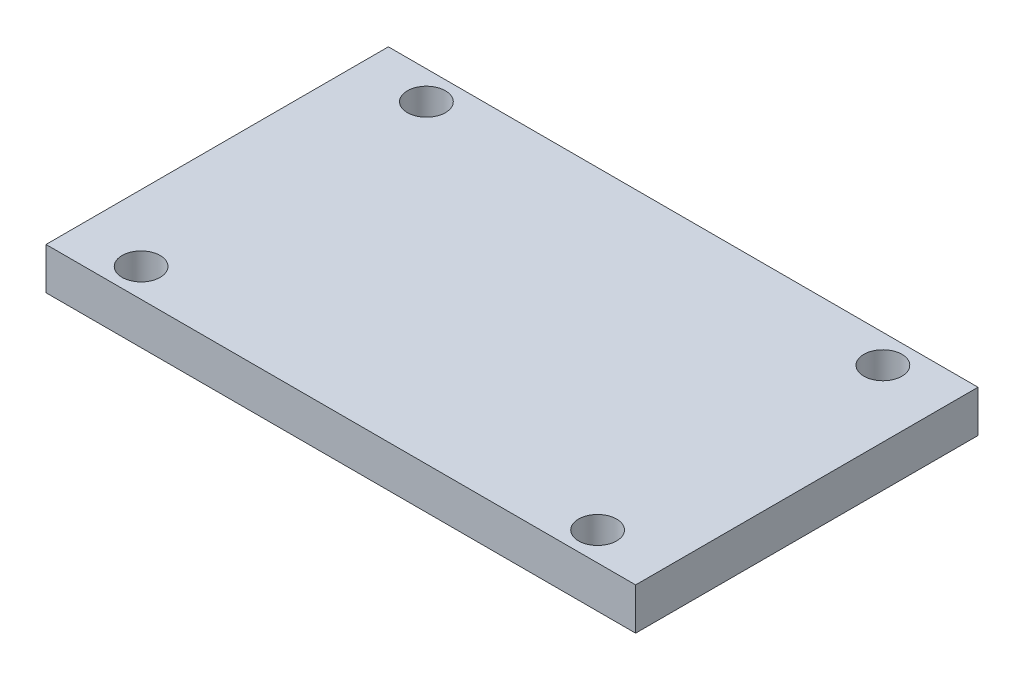
ISO-10303-21;
HEADER;
FILE_DESCRIPTION(('STEP AP214'),'2;1');
FILE_NAME('part.step','',(''),(''),'','','');
FILE_SCHEMA(('AUTOMOTIVE_DESIGN { 1 0 10303 214 1 1 1 1 }'));
ENDSEC;
DATA;
#1=APPLICATION_CONTEXT('core data for automotive mechanical design processes');
#2=APPLICATION_PROTOCOL_DEFINITION('international standard','automotive_design',2000,#1);
#3=PRODUCT_CONTEXT('',#1,'mechanical');
#4=PRODUCT('Part','Part','',(#3));
#5=PRODUCT_RELATED_PRODUCT_CATEGORY('part','',(#4));
#6=PRODUCT_DEFINITION_FORMATION('','',#4);
#7=PRODUCT_DEFINITION_CONTEXT('part definition',#1,'design');
#8=PRODUCT_DEFINITION('design','',#6,#7);
#9=PRODUCT_DEFINITION_SHAPE('','',#8);
#10=(LENGTH_UNIT() NAMED_UNIT(*) SI_UNIT(.MILLI.,.METRE.));
#11=(NAMED_UNIT(*) PLANE_ANGLE_UNIT() SI_UNIT($,.RADIAN.));
#12=(NAMED_UNIT(*) SI_UNIT($,.STERADIAN.) SOLID_ANGLE_UNIT());
#13=UNCERTAINTY_MEASURE_WITH_UNIT(LENGTH_MEASURE(1.E-05),#10,'distance_accuracy_value','');
#14=(GEOMETRIC_REPRESENTATION_CONTEXT(3) GLOBAL_UNCERTAINTY_ASSIGNED_CONTEXT((#13)) GLOBAL_UNIT_ASSIGNED_CONTEXT((#10,
#11,#12)) REPRESENTATION_CONTEXT('',''));
#15=CARTESIAN_POINT('',(0.,0.,0.));
#16=DIRECTION('',(0.,0.,1.));
#17=DIRECTION('',(1.,0.,0.));
#18=AXIS2_PLACEMENT_3D('',#15,#16,#17);
#19=CARTESIAN_POINT('',(77.5,11.,-45.));
#20=DIRECTION('',(-1.,0.,0.));
#21=DIRECTION('',(0.,0.,1.));
#22=AXIS2_PLACEMENT_3D('',#19,#20,#21);
#23=PLANE('',#22);
#24=DIRECTION('',(0.,0.,-1.));
#25=VECTOR('',#24,1.);
#26=CARTESIAN_POINT('',(77.5,0.,-45.));
#27=LINE('',#26,#25);
#28=CARTESIAN_POINT('',(77.5,0.,45.));
#29=VERTEX_POINT('',#28);
#30=CARTESIAN_POINT('',(77.5,0.,-45.));
#31=VERTEX_POINT('',#30);
#32=EDGE_CURVE('E104',#29,#31,#27,.T.);
#33=ORIENTED_EDGE('',*,*,#32,.T.);
#34=DIRECTION('',(0.,-1.,0.));
#35=VECTOR('',#34,1.);
#36=CARTESIAN_POINT('',(77.5,11.,-45.));
#37=LINE('',#36,#35);
#38=CARTESIAN_POINT('',(77.5,11.,-45.));
#39=VERTEX_POINT('',#38);
#40=EDGE_CURVE('E11',#39,#31,#37,.T.);
#41=ORIENTED_EDGE('',*,*,#40,.F.);
#42=DIRECTION('',(0.,0.,-1.));
#43=VECTOR('',#42,1.);
#44=CARTESIAN_POINT('',(77.5,11.,-45.));
#45=LINE('',#44,#43);
#46=CARTESIAN_POINT('',(77.5,11.,45.));
#47=VERTEX_POINT('',#46);
#48=EDGE_CURVE('E92',#47,#39,#45,.T.);
#49=ORIENTED_EDGE('',*,*,#48,.F.);
#50=DIRECTION('',(0.,-1.,0.));
#51=VECTOR('',#50,1.);
#52=CARTESIAN_POINT('',(77.5,11.,45.));
#53=LINE('',#52,#51);
#54=EDGE_CURVE('E100',#47,#29,#53,.T.);
#55=ORIENTED_EDGE('',*,*,#54,.T.);
#56=EDGE_LOOP('',(#33,#41,#49,#55));
#57=FACE_BOUND('',#56,.T.);
#58=ADVANCED_FACE('F41',(#57),#23,.F.);
#59=CARTESIAN_POINT('',(-77.5,11.,-45.));
#60=DIRECTION('',(0.,0.,1.));
#61=DIRECTION('',(1.,0.,0.));
#62=AXIS2_PLACEMENT_3D('',#59,#60,#61);
#63=PLANE('',#62);
#64=DIRECTION('',(-1.,0.,0.));
#65=VECTOR('',#64,1.);
#66=CARTESIAN_POINT('',(-77.5,0.,-45.));
#67=LINE('',#66,#65);
#68=CARTESIAN_POINT('',(-77.5,0.,-45.));
#69=VERTEX_POINT('',#68);
#70=EDGE_CURVE('E96',#31,#69,#67,.T.);
#71=ORIENTED_EDGE('',*,*,#70,.T.);
#72=DIRECTION('',(0.,-1.,0.));
#73=VECTOR('',#72,1.);
#74=CARTESIAN_POINT('',(-77.5,11.,-45.));
#75=LINE('',#74,#73);
#76=CARTESIAN_POINT('',(-77.5,11.,-45.));
#77=VERTEX_POINT('',#76);
#78=EDGE_CURVE('E49',#77,#69,#75,.T.);
#79=ORIENTED_EDGE('',*,*,#78,.F.);
#80=DIRECTION('',(-1.,0.,0.));
#81=VECTOR('',#80,1.);
#82=CARTESIAN_POINT('',(-77.5,11.,-45.));
#83=LINE('',#82,#81);
#84=EDGE_CURVE('E87',#39,#77,#83,.T.);
#85=ORIENTED_EDGE('',*,*,#84,.F.);
#86=ORIENTED_EDGE('',*,*,#40,.T.);
#87=EDGE_LOOP('',(#71,#79,#85,#86));
#88=FACE_BOUND('',#87,.T.);
#89=ADVANCED_FACE('F95',(#88),#63,.F.);
#90=CARTESIAN_POINT('',(-77.5,11.,-45.));
#91=DIRECTION('',(1.,0.,0.));
#92=DIRECTION('',(0.,0.,-1.));
#93=AXIS2_PLACEMENT_3D('',#90,#91,#92);
#94=PLANE('',#93);
#95=DIRECTION('',(0.,0.,1.));
#96=VECTOR('',#95,1.);
#97=CARTESIAN_POINT('',(-77.5,0.,-45.));
#98=LINE('',#97,#96);
#99=CARTESIAN_POINT('',(-77.5,0.,45.));
#100=VERTEX_POINT('',#99);
#101=EDGE_CURVE('E74',#69,#100,#98,.T.);
#102=ORIENTED_EDGE('',*,*,#101,.T.);
#103=DIRECTION('',(0.,-1.,0.));
#104=VECTOR('',#103,1.);
#105=CARTESIAN_POINT('',(-77.5,11.,45.));
#106=LINE('',#105,#104);
#107=CARTESIAN_POINT('',(-77.5,11.,45.));
#108=VERTEX_POINT('',#107);
#109=EDGE_CURVE('E97',#108,#100,#106,.T.);
#110=ORIENTED_EDGE('',*,*,#109,.F.);
#111=DIRECTION('',(0.,0.,1.));
#112=VECTOR('',#111,1.);
#113=CARTESIAN_POINT('',(-77.5,11.,-45.));
#114=LINE('',#113,#112);
#115=EDGE_CURVE('E90',#77,#108,#114,.T.);
#116=ORIENTED_EDGE('',*,*,#115,.F.);
#117=ORIENTED_EDGE('',*,*,#78,.T.);
#118=EDGE_LOOP('',(#102,#110,#116,#117));
#119=FACE_BOUND('',#118,.T.);
#120=ADVANCED_FACE('F98',(#119),#94,.F.);
#121=CARTESIAN_POINT('',(-77.5,11.,45.));
#122=DIRECTION('',(0.,0.,-1.));
#123=DIRECTION('',(-1.,0.,0.));
#124=AXIS2_PLACEMENT_3D('',#121,#122,#123);
#125=PLANE('',#124);
#126=DIRECTION('',(1.,0.,0.));
#127=VECTOR('',#126,1.);
#128=CARTESIAN_POINT('',(-77.5,0.,45.));
#129=LINE('',#128,#127);
#130=EDGE_CURVE('E80',#100,#29,#129,.T.);
#131=ORIENTED_EDGE('',*,*,#130,.T.);
#132=ORIENTED_EDGE('',*,*,#54,.F.);
#133=DIRECTION('',(1.,0.,0.));
#134=VECTOR('',#133,1.);
#135=CARTESIAN_POINT('',(-77.5,11.,45.));
#136=LINE('',#135,#134);
#137=EDGE_CURVE('E57',#108,#47,#136,.T.);
#138=ORIENTED_EDGE('',*,*,#137,.F.);
#139=ORIENTED_EDGE('',*,*,#109,.T.);
#140=EDGE_LOOP('',(#131,#132,#138,#139));
#141=FACE_BOUND('',#140,.T.);
#142=ADVANCED_FACE('F112',(#141),#125,.F.);
#143=CARTESIAN_POINT('',(0.,11.,0.));
#144=DIRECTION('',(0.,1.,0.));
#145=DIRECTION('',(0.,0.,1.));
#146=AXIS2_PLACEMENT_3D('',#143,#144,#145);
#147=PLANE('',#146);
#148=CARTESIAN_POINT('',(-60.,11.,-37.5));
#149=DIRECTION('',(0.,-1.,0.));
#150=DIRECTION('',(0.,0.,-1.));
#151=AXIS2_PLACEMENT_3D('',#148,#149,#150);
#152=CIRCLE('',#151,5.);
#153=CARTESIAN_POINT('',(-60.,11.,-42.5));
#154=VERTEX_POINT('',#153);
#155=EDGE_CURVE('E124',#154,#154,#152,.T.);
#156=ORIENTED_EDGE('',*,*,#155,.T.);
#157=EDGE_LOOP('',(#156));
#158=FACE_BOUND('',#157,.T.);
#159=CARTESIAN_POINT('',(-60.,11.,37.5));
#160=DIRECTION('',(0.,-1.,0.));
#161=DIRECTION('',(0.,0.,-1.));
#162=AXIS2_PLACEMENT_3D('',#159,#160,#161);
#163=CIRCLE('',#162,5.00000000000001);
#164=CARTESIAN_POINT('',(-60.,11.,32.5));
#165=VERTEX_POINT('',#164);
#166=EDGE_CURVE('E130',#165,#165,#163,.T.);
#167=ORIENTED_EDGE('',*,*,#166,.T.);
#168=EDGE_LOOP('',(#167));
#169=FACE_BOUND('',#168,.T.);
#170=CARTESIAN_POINT('',(60.,11.,37.5));
#171=DIRECTION('',(0.,-1.,0.));
#172=DIRECTION('',(0.,0.,-1.));
#173=AXIS2_PLACEMENT_3D('',#170,#171,#172);
#174=CIRCLE('',#173,5.00000000000001);
#175=CARTESIAN_POINT('',(60.,11.,32.5));
#176=VERTEX_POINT('',#175);
#177=EDGE_CURVE('E136',#176,#176,#174,.T.);
#178=ORIENTED_EDGE('',*,*,#177,.T.);
#179=EDGE_LOOP('',(#178));
#180=FACE_BOUND('',#179,.T.);
#181=CARTESIAN_POINT('',(60.,11.,-37.4999999999999));
#182=DIRECTION('',(0.,-1.,0.));
#183=DIRECTION('',(0.,0.,-1.));
#184=AXIS2_PLACEMENT_3D('',#181,#182,#183);
#185=CIRCLE('',#184,5.00000000000001);
#186=CARTESIAN_POINT('',(60.,11.,-42.4999999999999));
#187=VERTEX_POINT('',#186);
#188=EDGE_CURVE('E107',#187,#187,#185,.T.);
#189=ORIENTED_EDGE('',*,*,#188,.T.);
#190=EDGE_LOOP('',(#189));
#191=FACE_BOUND('',#190,.T.);
#192=ORIENTED_EDGE('',*,*,#48,.T.);
#193=ORIENTED_EDGE('',*,*,#84,.T.);
#194=ORIENTED_EDGE('',*,*,#115,.T.);
#195=ORIENTED_EDGE('',*,*,#137,.T.);
#196=EDGE_LOOP('',(#192,#193,#194,#195));
#197=FACE_BOUND('',#196,.T.);
#198=ADVANCED_FACE('F88',(#158,#169,#180,#191,#197),#147,.T.);
#199=CARTESIAN_POINT('',(0.,0.,0.));
#200=DIRECTION('',(0.,1.,0.));
#201=DIRECTION('',(0.,0.,1.));
#202=AXIS2_PLACEMENT_3D('',#199,#200,#201);
#203=PLANE('',#202);
#204=CARTESIAN_POINT('',(-60.,0.,-37.5));
#205=DIRECTION('',(0.,-1.,0.));
#206=DIRECTION('',(0.,0.,-1.));
#207=AXIS2_PLACEMENT_3D('',#204,#205,#206);
#208=CIRCLE('',#207,5.);
#209=CARTESIAN_POINT('',(-60.,0.,-42.5));
#210=VERTEX_POINT('',#209);
#211=EDGE_CURVE('E127',#210,#210,#208,.T.);
#212=ORIENTED_EDGE('',*,*,#211,.F.);
#213=EDGE_LOOP('',(#212));
#214=FACE_BOUND('',#213,.T.);
#215=CARTESIAN_POINT('',(-60.,0.,37.5));
#216=DIRECTION('',(0.,-1.,0.));
#217=DIRECTION('',(0.,0.,-1.));
#218=AXIS2_PLACEMENT_3D('',#215,#216,#217);
#219=CIRCLE('',#218,5.00000000000001);
#220=CARTESIAN_POINT('',(-60.,0.,32.5));
#221=VERTEX_POINT('',#220);
#222=EDGE_CURVE('E133',#221,#221,#219,.T.);
#223=ORIENTED_EDGE('',*,*,#222,.F.);
#224=EDGE_LOOP('',(#223));
#225=FACE_BOUND('',#224,.T.);
#226=CARTESIAN_POINT('',(60.,0.,37.5));
#227=DIRECTION('',(0.,-1.,0.));
#228=DIRECTION('',(0.,0.,-1.));
#229=AXIS2_PLACEMENT_3D('',#226,#227,#228);
#230=CIRCLE('',#229,5.00000000000001);
#231=CARTESIAN_POINT('',(60.,0.,32.5));
#232=VERTEX_POINT('',#231);
#233=EDGE_CURVE('E121',#232,#232,#230,.T.);
#234=ORIENTED_EDGE('',*,*,#233,.F.);
#235=EDGE_LOOP('',(#234));
#236=FACE_BOUND('',#235,.T.);
#237=CARTESIAN_POINT('',(60.,0.,-37.4999999999999));
#238=DIRECTION('',(0.,-1.,0.));
#239=DIRECTION('',(0.,0.,-1.));
#240=AXIS2_PLACEMENT_3D('',#237,#238,#239);
#241=CIRCLE('',#240,5.00000000000001);
#242=CARTESIAN_POINT('',(60.,0.,-42.4999999999999));
#243=VERTEX_POINT('',#242);
#244=EDGE_CURVE('E118',#243,#243,#241,.T.);
#245=ORIENTED_EDGE('',*,*,#244,.F.);
#246=EDGE_LOOP('',(#245));
#247=FACE_BOUND('',#246,.T.);
#248=ORIENTED_EDGE('',*,*,#32,.F.);
#249=ORIENTED_EDGE('',*,*,#130,.F.);
#250=ORIENTED_EDGE('',*,*,#101,.F.);
#251=ORIENTED_EDGE('',*,*,#70,.F.);
#252=EDGE_LOOP('',(#248,#249,#250,#251));
#253=FACE_BOUND('',#252,.T.);
#254=ADVANCED_FACE('F115',(#214,#225,#236,#247,#253),#203,.F.);
#255=CARTESIAN_POINT('',(60.,11.,-37.4999999999999));
#256=DIRECTION('',(0.,-1.,0.));
#257=DIRECTION('',(0.,0.,-1.));
#258=AXIS2_PLACEMENT_3D('',#255,#256,#257);
#259=CYLINDRICAL_SURFACE('',#258,5.00000000000001);
#260=ORIENTED_EDGE('',*,*,#188,.F.);
#261=EDGE_LOOP('',(#260));
#262=FACE_BOUND('',#261,.T.);
#263=ORIENTED_EDGE('',*,*,#244,.T.);
#264=EDGE_LOOP('',(#263));
#265=FACE_BOUND('',#264,.T.);
#266=ADVANCED_FACE('F146',(#262,#265),#259,.F.);
#267=CARTESIAN_POINT('',(60.,11.,37.5));
#268=DIRECTION('',(0.,-1.,0.));
#269=DIRECTION('',(0.,0.,-1.));
#270=AXIS2_PLACEMENT_3D('',#267,#268,#269);
#271=CYLINDRICAL_SURFACE('',#270,5.00000000000001);
#272=ORIENTED_EDGE('',*,*,#177,.F.);
#273=EDGE_LOOP('',(#272));
#274=FACE_BOUND('',#273,.T.);
#275=ORIENTED_EDGE('',*,*,#233,.T.);
#276=EDGE_LOOP('',(#275));
#277=FACE_BOUND('',#276,.T.);
#278=ADVANCED_FACE('F142',(#274,#277),#271,.F.);
#279=CARTESIAN_POINT('',(-60.,11.,37.5));
#280=DIRECTION('',(0.,-1.,0.));
#281=DIRECTION('',(0.,0.,-1.));
#282=AXIS2_PLACEMENT_3D('',#279,#280,#281);
#283=CYLINDRICAL_SURFACE('',#282,5.00000000000001);
#284=ORIENTED_EDGE('',*,*,#166,.F.);
#285=EDGE_LOOP('',(#284));
#286=FACE_BOUND('',#285,.T.);
#287=ORIENTED_EDGE('',*,*,#222,.T.);
#288=EDGE_LOOP('',(#287));
#289=FACE_BOUND('',#288,.T.);
#290=ADVANCED_FACE('F157',(#286,#289),#283,.F.);
#291=CARTESIAN_POINT('',(-60.,11.,-37.5));
#292=DIRECTION('',(0.,-1.,0.));
#293=DIRECTION('',(0.,0.,-1.));
#294=AXIS2_PLACEMENT_3D('',#291,#292,#293);
#295=CYLINDRICAL_SURFACE('',#294,5.);
#296=ORIENTED_EDGE('',*,*,#155,.F.);
#297=EDGE_LOOP('',(#296));
#298=FACE_BOUND('',#297,.T.);
#299=ORIENTED_EDGE('',*,*,#211,.T.);
#300=EDGE_LOOP('',(#299));
#301=FACE_BOUND('',#300,.T.);
#302=ADVANCED_FACE('F186',(#298,#301),#295,.F.);
#303=CLOSED_SHELL('',(#58,#89,#120,#142,#198,#254,#266,#278,#290,#302));
#304=MANIFOLD_SOLID_BREP('B2',#303);
#305=ADVANCED_BREP_SHAPE_REPRESENTATION('',(#18,#304),#14);
#306=SHAPE_DEFINITION_REPRESENTATION(#9,#305);
ENDSEC;
END-ISO-10303-21;
